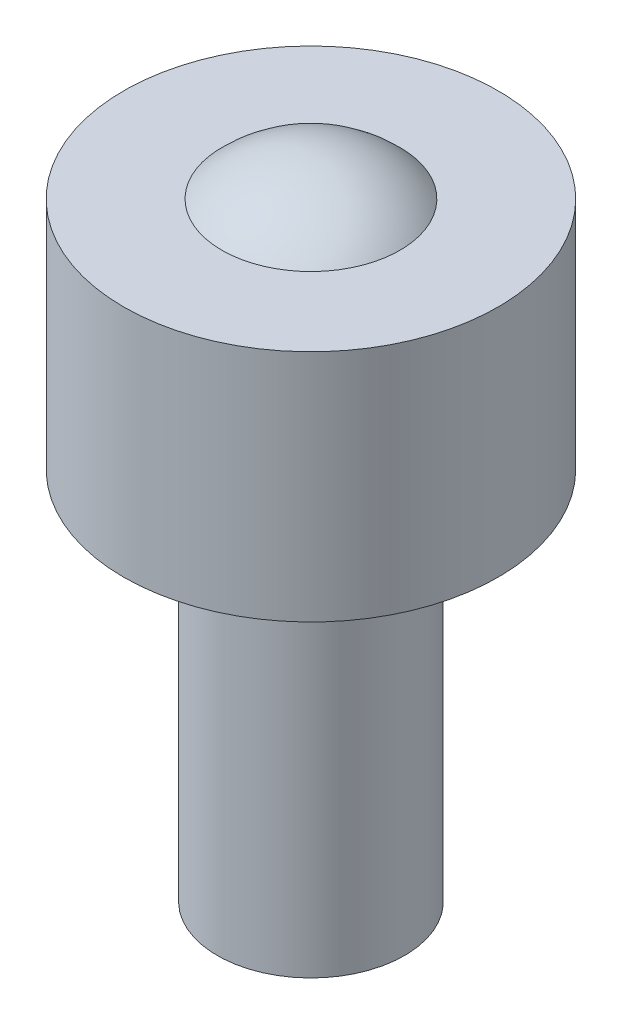
ISO-10303-21;
HEADER;
FILE_DESCRIPTION(('STEP AP214'),'2;1');
FILE_NAME('part.step','',(''),(''),'','','');
FILE_SCHEMA(('AUTOMOTIVE_DESIGN { 1 0 10303 214 1 1 1 1 }'));
ENDSEC;
DATA;
#1=APPLICATION_CONTEXT('core data for automotive mechanical design processes');
#2=APPLICATION_PROTOCOL_DEFINITION('international standard','automotive_design',2000,#1);
#3=PRODUCT_CONTEXT('',#1,'mechanical');
#4=PRODUCT('Part','Part','',(#3));
#5=PRODUCT_RELATED_PRODUCT_CATEGORY('part','',(#4));
#6=PRODUCT_DEFINITION_FORMATION('','',#4);
#7=PRODUCT_DEFINITION_CONTEXT('part definition',#1,'design');
#8=PRODUCT_DEFINITION('design','',#6,#7);
#9=PRODUCT_DEFINITION_SHAPE('','',#8);
#10=(LENGTH_UNIT() NAMED_UNIT(*) SI_UNIT(.MILLI.,.METRE.));
#11=(NAMED_UNIT(*) PLANE_ANGLE_UNIT() SI_UNIT($,.RADIAN.));
#12=(NAMED_UNIT(*) SI_UNIT($,.STERADIAN.) SOLID_ANGLE_UNIT());
#13=UNCERTAINTY_MEASURE_WITH_UNIT(LENGTH_MEASURE(1.E-05),#10,'distance_accuracy_value','');
#14=(GEOMETRIC_REPRESENTATION_CONTEXT(3) GLOBAL_UNCERTAINTY_ASSIGNED_CONTEXT((#13)) GLOBAL_UNIT_ASSIGNED_CONTEXT((#10,
#11,#12)) REPRESENTATION_CONTEXT('',''));
#15=CARTESIAN_POINT('',(0.,0.,0.));
#16=DIRECTION('',(0.,0.,1.));
#17=DIRECTION('',(1.,0.,0.));
#18=AXIS2_PLACEMENT_3D('',#15,#16,#17);
#19=CARTESIAN_POINT('',(0.,4.7,0.));
#20=DIRECTION('',(0.,-1.,0.));
#21=DIRECTION('',(0.,0.,1.));
#22=AXIS2_PLACEMENT_3D('',#19,#20,#21);
#23=SPHERICAL_SURFACE('',#22,4.);
#24=CARTESIAN_POINT('',(0.,0.699999999999999,0.));
#25=VERTEX_POINT('',#24);
#26=VERTEX_LOOP('',#25);
#27=FACE_BOUND('',#26,.T.);
#28=ADVANCED_FACE('F38',(#27),#23,.T.);
#29=CLOSED_SHELL('',(#28));
#30=MANIFOLD_SOLID_BREP('B2',#29);
#31=CARTESIAN_POINT('',(0.,7.5,0.));
#32=DIRECTION('',(0.,-1.,0.));
#33=DIRECTION('',(0.,0.,-1.));
#34=AXIS2_PLACEMENT_3D('',#31,#32,#33);
#35=CYLINDRICAL_SURFACE('',#34,6.);
#36=CARTESIAN_POINT('',(0.,7.5,0.));
#37=DIRECTION('',(0.,1.,0.));
#38=DIRECTION('',(0.,0.,1.));
#39=AXIS2_PLACEMENT_3D('',#36,#37,#38);
#40=CIRCLE('',#39,6.);
#41=CARTESIAN_POINT('',(0.,7.5,6.));
#42=VERTEX_POINT('',#41);
#43=EDGE_CURVE('E57',#42,#42,#40,.T.);
#44=ORIENTED_EDGE('',*,*,#43,.F.);
#45=EDGE_LOOP('',(#44));
#46=FACE_BOUND('',#45,.T.);
#47=CARTESIAN_POINT('',(0.,0.,0.));
#48=DIRECTION('',(0.,1.,0.));
#49=DIRECTION('',(0.,0.,1.));
#50=AXIS2_PLACEMENT_3D('',#47,#48,#49);
#51=CIRCLE('',#50,6.);
#52=CARTESIAN_POINT('',(0.,0.,6.));
#53=VERTEX_POINT('',#52);
#54=EDGE_CURVE('E53',#53,#53,#51,.T.);
#55=ORIENTED_EDGE('',*,*,#54,.T.);
#56=EDGE_LOOP('',(#55));
#57=FACE_BOUND('',#56,.T.);
#58=ADVANCED_FACE('F50',(#46,#57),#35,.T.);
#59=CARTESIAN_POINT('',(0.,7.5,0.));
#60=DIRECTION('',(0.,1.,0.));
#61=DIRECTION('',(0.,0.,1.));
#62=AXIS2_PLACEMENT_3D('',#59,#60,#61);
#63=PLANE('',#62);
#64=ORIENTED_EDGE('',*,*,#43,.T.);
#65=EDGE_LOOP('',(#64));
#66=FACE_BOUND('',#65,.T.);
#67=ADVANCED_FACE('F74',(#66),#63,.T.);
#68=CARTESIAN_POINT('',(0.,0.,0.));
#69=DIRECTION('',(0.,1.,0.));
#70=DIRECTION('',(0.,0.,1.));
#71=AXIS2_PLACEMENT_3D('',#68,#69,#70);
#72=PLANE('',#71);
#73=CARTESIAN_POINT('',(0.,0.,0.));
#74=DIRECTION('',(0.,-1.,0.));
#75=DIRECTION('',(0.,0.,-1.));
#76=AXIS2_PLACEMENT_3D('',#73,#74,#75);
#77=CIRCLE('',#76,3.);
#78=CARTESIAN_POINT('',(0.,0.,-3.));
#79=VERTEX_POINT('',#78);
#80=EDGE_CURVE('E37',#79,#79,#77,.T.);
#81=ORIENTED_EDGE('',*,*,#80,.F.);
#82=EDGE_LOOP('',(#81));
#83=FACE_BOUND('',#82,.T.);
#84=ORIENTED_EDGE('',*,*,#54,.F.);
#85=EDGE_LOOP('',(#84));
#86=FACE_BOUND('',#85,.T.);
#87=ADVANCED_FACE('F71',(#83,#86),#72,.F.);
#88=CARTESIAN_POINT('',(0.,-12.,0.));
#89=DIRECTION('',(0.,1.,0.));
#90=DIRECTION('',(0.,0.,1.));
#91=AXIS2_PLACEMENT_3D('',#88,#89,#90);
#92=CYLINDRICAL_SURFACE('',#91,3.);
#93=CARTESIAN_POINT('',(0.,-12.,0.));
#94=DIRECTION('',(0.,-1.,0.));
#95=DIRECTION('',(0.,0.,-1.));
#96=AXIS2_PLACEMENT_3D('',#93,#94,#95);
#97=CIRCLE('',#96,3.);
#98=CARTESIAN_POINT('',(0.,-12.,-3.));
#99=VERTEX_POINT('',#98);
#100=EDGE_CURVE('E63',#99,#99,#97,.T.);
#101=ORIENTED_EDGE('',*,*,#100,.F.);
#102=EDGE_LOOP('',(#101));
#103=FACE_BOUND('',#102,.T.);
#104=ORIENTED_EDGE('',*,*,#80,.T.);
#105=EDGE_LOOP('',(#104));
#106=FACE_BOUND('',#105,.T.);
#107=ADVANCED_FACE('F73',(#103,#106),#92,.T.);
#108=CARTESIAN_POINT('',(0.,-12.,0.));
#109=DIRECTION('',(0.,-1.,0.));
#110=DIRECTION('',(0.,0.,-1.));
#111=AXIS2_PLACEMENT_3D('',#108,#109,#110);
#112=PLANE('',#111);
#113=ORIENTED_EDGE('',*,*,#100,.T.);
#114=EDGE_LOOP('',(#113));
#115=FACE_BOUND('',#114,.T.);
#116=ADVANCED_FACE('F80',(#115),#112,.T.);
#117=CLOSED_SHELL('',(#58,#67,#87,#107,#116));
#118=MANIFOLD_SOLID_BREP('B6',#117);
#119=ADVANCED_BREP_SHAPE_REPRESENTATION('',(#18,#30,#118),#14);
#120=SHAPE_DEFINITION_REPRESENTATION(#9,#119);
ENDSEC;
END-ISO-10303-21;
